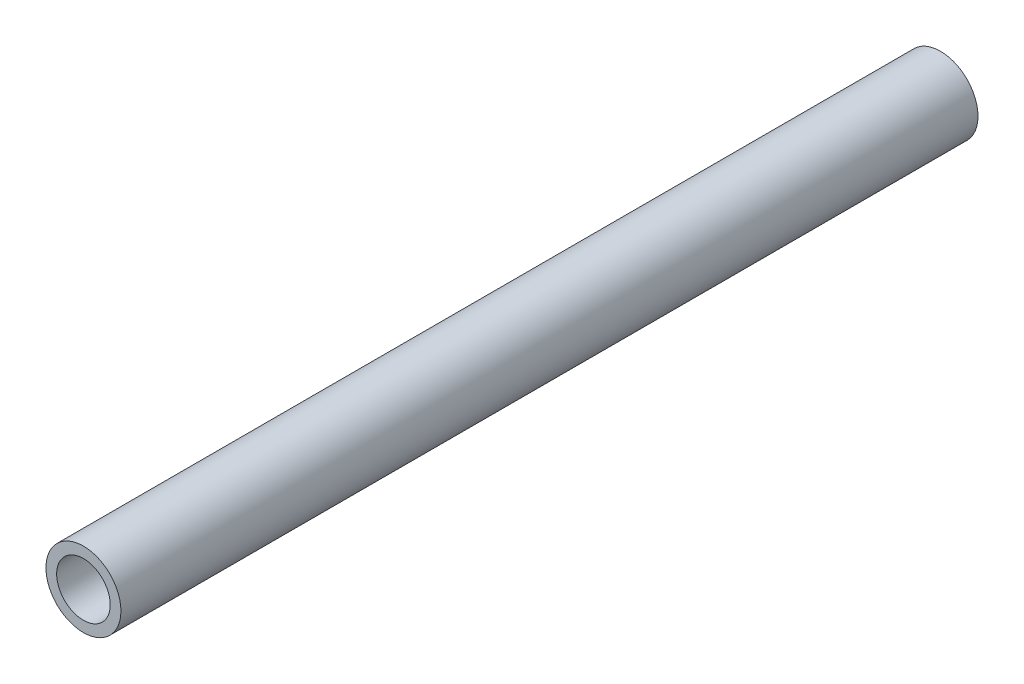
ISO-10303-21;
HEADER;
FILE_DESCRIPTION(('STEP AP214'),'2;1');
FILE_NAME('part.step','',(''),(''),'','','');
FILE_SCHEMA(('AUTOMOTIVE_DESIGN { 1 0 10303 214 1 1 1 1 }'));
ENDSEC;
DATA;
#1=APPLICATION_CONTEXT('core data for automotive mechanical design processes');
#2=APPLICATION_PROTOCOL_DEFINITION('international standard','automotive_design',2000,#1);
#3=PRODUCT_CONTEXT('',#1,'mechanical');
#4=PRODUCT('Part','Part','',(#3));
#5=PRODUCT_RELATED_PRODUCT_CATEGORY('part','',(#4));
#6=PRODUCT_DEFINITION_FORMATION('','',#4);
#7=PRODUCT_DEFINITION_CONTEXT('part definition',#1,'design');
#8=PRODUCT_DEFINITION('design','',#6,#7);
#9=PRODUCT_DEFINITION_SHAPE('','',#8);
#10=(LENGTH_UNIT() NAMED_UNIT(*) SI_UNIT(.MILLI.,.METRE.));
#11=(NAMED_UNIT(*) PLANE_ANGLE_UNIT() SI_UNIT($,.RADIAN.));
#12=(NAMED_UNIT(*) SI_UNIT($,.STERADIAN.) SOLID_ANGLE_UNIT());
#13=UNCERTAINTY_MEASURE_WITH_UNIT(LENGTH_MEASURE(1.E-05),#10,'distance_accuracy_value','');
#14=(GEOMETRIC_REPRESENTATION_CONTEXT(3) GLOBAL_UNCERTAINTY_ASSIGNED_CONTEXT((#13)) GLOBAL_UNIT_ASSIGNED_CONTEXT((#10,
#11,#12)) REPRESENTATION_CONTEXT('',''));
#15=CARTESIAN_POINT('',(0.,0.,0.));
#16=DIRECTION('',(0.,0.,1.));
#17=DIRECTION('',(1.,0.,0.));
#18=AXIS2_PLACEMENT_3D('',#15,#16,#17);
#19=CARTESIAN_POINT('',(0.,457.253610620621,-80.));
#20=DIRECTION('',(0.,0.,1.));
#21=DIRECTION('',(1.,0.,0.));
#22=AXIS2_PLACEMENT_3D('',#19,#20,#21);
#23=CYLINDRICAL_SURFACE('',#22,3.5);
#24=CARTESIAN_POINT('',(0.,457.253610620621,-80.));
#25=DIRECTION('',(0.,0.,1.));
#26=DIRECTION('',(1.,0.,0.));
#27=AXIS2_PLACEMENT_3D('',#24,#25,#26);
#28=CIRCLE('',#27,3.5);
#29=CARTESIAN_POINT('',(3.5,457.253610620621,-80.));
#30=VERTEX_POINT('',#29);
#31=EDGE_CURVE('E10',#30,#30,#28,.T.);
#32=ORIENTED_EDGE('',*,*,#31,.T.);
#33=EDGE_LOOP('',(#32));
#34=FACE_BOUND('',#33,.T.);
#35=CARTESIAN_POINT('',(0.,457.253610620621,0.));
#36=DIRECTION('',(0.,0.,1.));
#37=DIRECTION('',(1.,0.,0.));
#38=AXIS2_PLACEMENT_3D('',#35,#36,#37);
#39=CIRCLE('',#38,3.5);
#40=CARTESIAN_POINT('',(3.5,457.253610620621,0.));
#41=VERTEX_POINT('',#40);
#42=EDGE_CURVE('E34',#41,#41,#39,.T.);
#43=ORIENTED_EDGE('',*,*,#42,.F.);
#44=EDGE_LOOP('',(#43));
#45=FACE_BOUND('',#44,.T.);
#46=ADVANCED_FACE('F31',(#34,#45),#23,.T.);
#47=CARTESIAN_POINT('',(0.,457.253610620621,-80.));
#48=DIRECTION('',(0.,0.,1.));
#49=DIRECTION('',(1.,0.,0.));
#50=AXIS2_PLACEMENT_3D('',#47,#48,#49);
#51=PLANE('',#50);
#52=CARTESIAN_POINT('',(0.,457.253610620621,-80.));
#53=DIRECTION('',(0.,0.,1.));
#54=DIRECTION('',(1.,0.,0.));
#55=AXIS2_PLACEMENT_3D('',#52,#53,#54);
#56=CIRCLE('',#55,2.5);
#57=CARTESIAN_POINT('',(2.5,457.253610620621,-80.));
#58=VERTEX_POINT('',#57);
#59=EDGE_CURVE('E41',#58,#58,#56,.T.);
#60=ORIENTED_EDGE('',*,*,#59,.T.);
#61=EDGE_LOOP('',(#60));
#62=FACE_BOUND('',#61,.T.);
#63=ORIENTED_EDGE('',*,*,#31,.F.);
#64=EDGE_LOOP('',(#63));
#65=FACE_BOUND('',#64,.T.);
#66=ADVANCED_FACE('F49',(#62,#65),#51,.F.);
#67=CARTESIAN_POINT('',(0.,457.253610620621,0.));
#68=DIRECTION('',(0.,0.,1.));
#69=DIRECTION('',(1.,0.,0.));
#70=AXIS2_PLACEMENT_3D('',#67,#68,#69);
#71=PLANE('',#70);
#72=CARTESIAN_POINT('',(0.,457.253610620621,0.));
#73=DIRECTION('',(0.,0.,1.));
#74=DIRECTION('',(1.,0.,0.));
#75=AXIS2_PLACEMENT_3D('',#72,#73,#74);
#76=CIRCLE('',#75,2.5);
#77=CARTESIAN_POINT('',(2.5,457.253610620621,0.));
#78=VERTEX_POINT('',#77);
#79=EDGE_CURVE('E43',#78,#78,#76,.T.);
#80=ORIENTED_EDGE('',*,*,#79,.F.);
#81=EDGE_LOOP('',(#80));
#82=FACE_BOUND('',#81,.T.);
#83=ORIENTED_EDGE('',*,*,#42,.T.);
#84=EDGE_LOOP('',(#83));
#85=FACE_BOUND('',#84,.T.);
#86=ADVANCED_FACE('F55',(#82,#85),#71,.T.);
#87=CARTESIAN_POINT('',(0.,457.253610620621,-80.));
#88=DIRECTION('',(0.,0.,1.));
#89=DIRECTION('',(1.,0.,0.));
#90=AXIS2_PLACEMENT_3D('',#87,#88,#89);
#91=CYLINDRICAL_SURFACE('',#90,2.5);
#92=ORIENTED_EDGE('',*,*,#59,.F.);
#93=EDGE_LOOP('',(#92));
#94=FACE_BOUND('',#93,.T.);
#95=ORIENTED_EDGE('',*,*,#79,.T.);
#96=EDGE_LOOP('',(#95));
#97=FACE_BOUND('',#96,.T.);
#98=ADVANCED_FACE('F52',(#94,#97),#91,.F.);
#99=CLOSED_SHELL('',(#46,#66,#86,#98));
#100=MANIFOLD_SOLID_BREP('B2',#99);
#101=ADVANCED_BREP_SHAPE_REPRESENTATION('',(#18,#100),#14);
#102=SHAPE_DEFINITION_REPRESENTATION(#9,#101);
ENDSEC;
END-ISO-10303-21;
